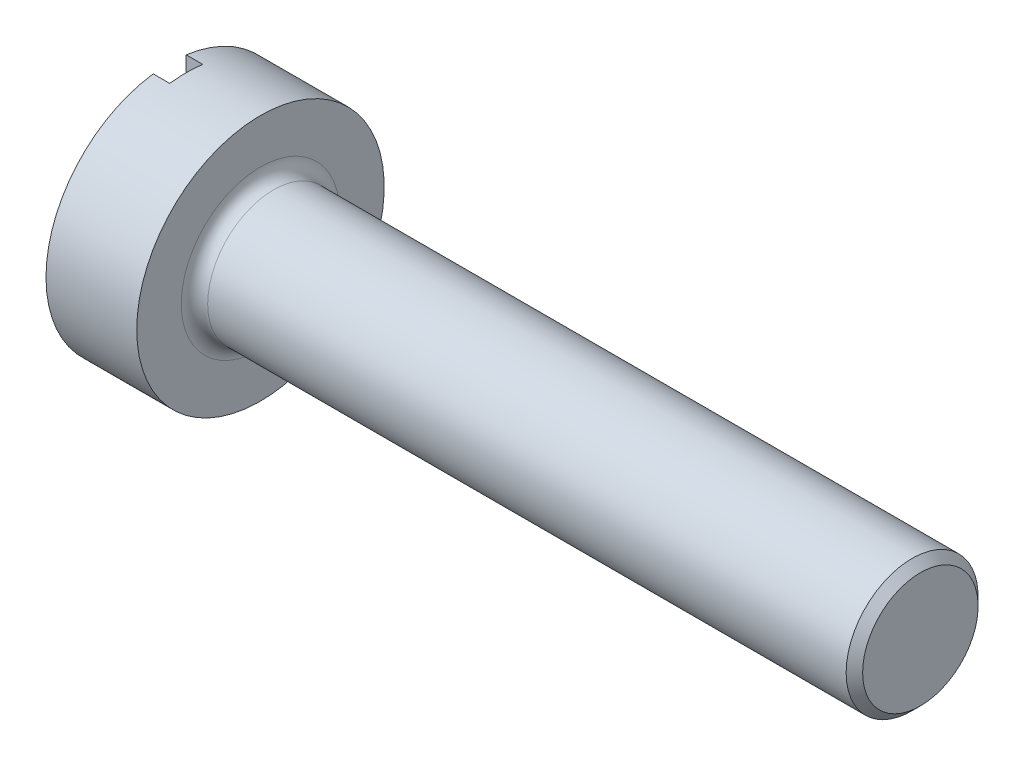
ISO-10303-21;
HEADER;
FILE_DESCRIPTION(('STEP AP214'),'2;1');
FILE_NAME('part.step','',(''),(''),'','','');
FILE_SCHEMA(('AUTOMOTIVE_DESIGN { 1 0 10303 214 1 1 1 1 }'));
ENDSEC;
DATA;
#1=APPLICATION_CONTEXT('core data for automotive mechanical design processes');
#2=APPLICATION_PROTOCOL_DEFINITION('international standard','automotive_design',2000,#1);
#3=PRODUCT_CONTEXT('',#1,'mechanical');
#4=PRODUCT('Part','Part','',(#3));
#5=PRODUCT_RELATED_PRODUCT_CATEGORY('part','',(#4));
#6=PRODUCT_DEFINITION_FORMATION('','',#4);
#7=PRODUCT_DEFINITION_CONTEXT('part definition',#1,'design');
#8=PRODUCT_DEFINITION('design','',#6,#7);
#9=PRODUCT_DEFINITION_SHAPE('','',#8);
#10=(LENGTH_UNIT() NAMED_UNIT(*) SI_UNIT(.MILLI.,.METRE.));
#11=(NAMED_UNIT(*) PLANE_ANGLE_UNIT() SI_UNIT($,.RADIAN.));
#12=(NAMED_UNIT(*) SI_UNIT($,.STERADIAN.) SOLID_ANGLE_UNIT());
#13=UNCERTAINTY_MEASURE_WITH_UNIT(LENGTH_MEASURE(1.E-05),#10,'distance_accuracy_value','');
#14=(GEOMETRIC_REPRESENTATION_CONTEXT(3) GLOBAL_UNCERTAINTY_ASSIGNED_CONTEXT((#13)) GLOBAL_UNIT_ASSIGNED_CONTEXT((#10,
#11,#12)) REPRESENTATION_CONTEXT('',''));
#15=CARTESIAN_POINT('',(0.,0.,0.));
#16=DIRECTION('',(0.,0.,1.));
#17=DIRECTION('',(1.,0.,0.));
#18=AXIS2_PLACEMENT_3D('',#15,#16,#17);
#19=CARTESIAN_POINT('',(0.,0.,0.));
#20=DIRECTION('',(-1.,0.,0.));
#21=DIRECTION('',(0.,0.,1.));
#22=AXIS2_PLACEMENT_3D('',#19,#20,#21);
#23=PLANE('',#22);
#24=CARTESIAN_POINT('',(0.,0.,0.));
#25=DIRECTION('',(-1.,0.,0.));
#26=DIRECTION('',(0.,0.,1.));
#27=AXIS2_PLACEMENT_3D('',#24,#25,#26);
#28=CIRCLE('',#27,1.5);
#29=CARTESIAN_POINT('',(0.,1.48660687473185,-0.2));
#30=VERTEX_POINT('',#29);
#31=CARTESIAN_POINT('',(0.,-1.48660687473185,-0.2));
#32=VERTEX_POINT('',#31);
#33=EDGE_CURVE('E86',#30,#32,#28,.T.);
#34=ORIENTED_EDGE('',*,*,#33,.T.);
#35=DIRECTION('',(0.,1.,0.));
#36=VECTOR('',#35,1.);
#37=CARTESIAN_POINT('',(0.,-1.5,-0.2));
#38=LINE('',#37,#36);
#39=EDGE_CURVE('E52',#32,#30,#38,.T.);
#40=ORIENTED_EDGE('',*,*,#39,.T.);
#41=EDGE_LOOP('',(#34,#40));
#42=FACE_BOUND('',#41,.T.);
#43=ADVANCED_FACE('F37',(#42),#23,.T.);
#44=CARTESIAN_POINT('',(0.,0.,0.));
#45=DIRECTION('',(-1.,0.,0.));
#46=DIRECTION('',(0.,0.,1.));
#47=AXIS2_PLACEMENT_3D('',#44,#45,#46);
#48=CYLINDRICAL_SURFACE('',#47,1.5);
#49=CARTESIAN_POINT('',(1.1,0.,0.));
#50=DIRECTION('',(-1.,0.,0.));
#51=DIRECTION('',(0.,0.,1.));
#52=AXIS2_PLACEMENT_3D('',#49,#50,#51);
#53=CIRCLE('',#52,1.5);
#54=CARTESIAN_POINT('',(1.1,0.,1.5));
#55=VERTEX_POINT('',#54);
#56=EDGE_CURVE('E92',#55,#55,#53,.T.);
#57=ORIENTED_EDGE('',*,*,#56,.T.);
#58=EDGE_LOOP('',(#57));
#59=FACE_BOUND('',#58,.T.);
#60=DIRECTION('',(-1.,0.,0.));
#61=VECTOR('',#60,1.);
#62=CARTESIAN_POINT('',(0.,-1.48660687473185,0.2));
#63=LINE('',#62,#61);
#64=CARTESIAN_POINT('',(0.2,-1.48660687473185,0.2));
#65=VERTEX_POINT('',#64);
#66=CARTESIAN_POINT('',(0.,-1.48660687473185,0.2));
#67=VERTEX_POINT('',#66);
#68=EDGE_CURVE('E11',#65,#67,#63,.T.);
#69=ORIENTED_EDGE('',*,*,#68,.F.);
#70=CARTESIAN_POINT('',(0.2,0.,0.));
#71=DIRECTION('',(-1.,0.,0.));
#72=DIRECTION('',(0.,0.,1.));
#73=AXIS2_PLACEMENT_3D('',#70,#71,#72);
#74=CIRCLE('',#73,1.5);
#75=CARTESIAN_POINT('',(0.2,-1.48660687473185,-0.2));
#76=VERTEX_POINT('',#75);
#77=EDGE_CURVE('E115',#65,#76,#74,.F.);
#78=ORIENTED_EDGE('',*,*,#77,.T.);
#79=DIRECTION('',(-1.,0.,0.));
#80=VECTOR('',#79,1.);
#81=CARTESIAN_POINT('',(0.,-1.48660687473185,-0.2));
#82=LINE('',#81,#80);
#83=EDGE_CURVE('E83',#76,#32,#82,.T.);
#84=ORIENTED_EDGE('',*,*,#83,.T.);
#85=ORIENTED_EDGE('',*,*,#33,.F.);
#86=DIRECTION('',(-1.,0.,0.));
#87=VECTOR('',#86,1.);
#88=CARTESIAN_POINT('',(0.,1.48660687473185,-0.2));
#89=LINE('',#88,#87);
#90=CARTESIAN_POINT('',(0.2,1.48660687473185,-0.2));
#91=VERTEX_POINT('',#90);
#92=EDGE_CURVE('E45',#30,#91,#89,.F.);
#93=ORIENTED_EDGE('',*,*,#92,.T.);
#94=CARTESIAN_POINT('',(0.2,1.48660687473185,0.2));
#95=VERTEX_POINT('',#94);
#96=EDGE_CURVE('E113',#91,#95,#74,.F.);
#97=ORIENTED_EDGE('',*,*,#96,.T.);
#98=DIRECTION('',(-1.,0.,0.));
#99=VECTOR('',#98,1.);
#100=CARTESIAN_POINT('',(0.,1.48660687473185,0.2));
#101=LINE('',#100,#99);
#102=CARTESIAN_POINT('',(0.,1.48660687473185,0.2));
#103=VERTEX_POINT('',#102);
#104=EDGE_CURVE('E60',#103,#95,#101,.F.);
#105=ORIENTED_EDGE('',*,*,#104,.F.);
#106=EDGE_CURVE('E93',#67,#103,#28,.T.);
#107=ORIENTED_EDGE('',*,*,#106,.F.);
#108=EDGE_LOOP('',(#69,#78,#84,#85,#93,#97,#105,#107));
#109=FACE_BOUND('',#108,.T.);
#110=ADVANCED_FACE('F90',(#59,#109),#48,.T.);
#111=DIRECTION('',(0.,1.,0.));
#112=VECTOR('',#111,1.);
#113=CARTESIAN_POINT('',(0.,-1.5,0.2));
#114=LINE('',#113,#112);
#115=EDGE_CURVE('E87',#67,#103,#114,.T.);
#116=ORIENTED_EDGE('',*,*,#115,.F.);
#117=ORIENTED_EDGE('',*,*,#106,.T.);
#118=EDGE_LOOP('',(#116,#117));
#119=FACE_BOUND('',#118,.T.);
#120=ADVANCED_FACE('F125',(#119),#23,.T.);
#121=CARTESIAN_POINT('',(9.1,0.,0.));
#122=DIRECTION('',(-1.,0.,0.));
#123=DIRECTION('',(0.,0.,1.));
#124=AXIS2_PLACEMENT_3D('',#121,#122,#123);
#125=PLANE('',#124);
#126=CARTESIAN_POINT('',(9.1,0.,0.));
#127=DIRECTION('',(-1.,0.,0.));
#128=DIRECTION('',(0.,0.,1.));
#129=AXIS2_PLACEMENT_3D('',#126,#127,#128);
#130=CIRCLE('',#129,0.699999999999998);
#131=CARTESIAN_POINT('',(9.1,0.,0.699999999999998));
#132=VERTEX_POINT('',#131);
#133=EDGE_CURVE('E104',#132,#132,#130,.F.);
#134=ORIENTED_EDGE('',*,*,#133,.T.);
#135=EDGE_LOOP('',(#134));
#136=FACE_BOUND('',#135,.T.);
#137=ADVANCED_FACE('F127',(#136),#125,.F.);
#138=CARTESIAN_POINT('',(0.,0.,0.));
#139=DIRECTION('',(-1.,0.,0.));
#140=DIRECTION('',(0.,0.,1.));
#141=AXIS2_PLACEMENT_3D('',#138,#139,#140);
#142=CYLINDRICAL_SURFACE('',#141,0.800000000000001);
#143=CARTESIAN_POINT('',(1.26,0.,0.));
#144=DIRECTION('',(1.,0.,0.));
#145=DIRECTION('',(0.,0.,-1.));
#146=AXIS2_PLACEMENT_3D('',#143,#144,#145);
#147=CIRCLE('',#146,0.800000000000001);
#148=CARTESIAN_POINT('',(1.26,0.,-0.800000000000001));
#149=VERTEX_POINT('',#148);
#150=EDGE_CURVE('E110',#149,#149,#147,.T.);
#151=ORIENTED_EDGE('',*,*,#150,.T.);
#152=EDGE_LOOP('',(#151));
#153=FACE_BOUND('',#152,.T.);
#154=CARTESIAN_POINT('',(9.,0.,0.));
#155=DIRECTION('',(-1.,0.,0.));
#156=DIRECTION('',(0.,0.,1.));
#157=AXIS2_PLACEMENT_3D('',#154,#155,#156);
#158=CIRCLE('',#157,0.800000000000001);
#159=CARTESIAN_POINT('',(9.,0.,0.800000000000001));
#160=VERTEX_POINT('',#159);
#161=EDGE_CURVE('E96',#160,#160,#158,.T.);
#162=ORIENTED_EDGE('',*,*,#161,.T.);
#163=EDGE_LOOP('',(#162));
#164=FACE_BOUND('',#163,.T.);
#165=ADVANCED_FACE('F133',(#153,#164),#142,.T.);
#166=CARTESIAN_POINT('',(1.1,0.,0.));
#167=DIRECTION('',(1.,0.,0.));
#168=DIRECTION('',(0.,0.,-1.));
#169=AXIS2_PLACEMENT_3D('',#166,#167,#168);
#170=PLANE('',#169);
#171=CARTESIAN_POINT('',(1.1,0.,0.));
#172=DIRECTION('',(1.,0.,0.));
#173=DIRECTION('',(0.,0.,-1.));
#174=AXIS2_PLACEMENT_3D('',#171,#172,#173);
#175=CIRCLE('',#174,0.960000000000001);
#176=CARTESIAN_POINT('',(1.1,0.,-0.960000000000001));
#177=VERTEX_POINT('',#176);
#178=EDGE_CURVE('E107',#177,#177,#175,.F.);
#179=ORIENTED_EDGE('',*,*,#178,.T.);
#180=EDGE_LOOP('',(#179));
#181=FACE_BOUND('',#180,.T.);
#182=ORIENTED_EDGE('',*,*,#56,.F.);
#183=EDGE_LOOP('',(#182));
#184=FACE_BOUND('',#183,.T.);
#185=ADVANCED_FACE('F183',(#181,#184),#170,.T.);
#186=CARTESIAN_POINT('',(9.,0.,0.));
#187=DIRECTION('',(-1.,0.,0.));
#188=DIRECTION('',(0.,0.,1.));
#189=AXIS2_PLACEMENT_3D('',#186,#187,#188);
#190=CONICAL_SURFACE('',#189,0.800000000000001,0.785398163397445);
#191=ORIENTED_EDGE('',*,*,#133,.F.);
#192=EDGE_LOOP('',(#191));
#193=FACE_BOUND('',#192,.T.);
#194=ORIENTED_EDGE('',*,*,#161,.F.);
#195=EDGE_LOOP('',(#194));
#196=FACE_BOUND('',#195,.T.);
#197=ADVANCED_FACE('F186',(#193,#196),#190,.T.);
#198=CARTESIAN_POINT('',(1.26,0.,0.));
#199=DIRECTION('',(1.,0.,0.));
#200=DIRECTION('',(0.,0.,-1.));
#201=AXIS2_PLACEMENT_3D('',#198,#199,#200);
#202=TOROIDAL_SURFACE('',#201,0.960000000000001,0.16);
#203=ORIENTED_EDGE('',*,*,#150,.F.);
#204=EDGE_LOOP('',(#203));
#205=FACE_BOUND('',#204,.T.);
#206=ORIENTED_EDGE('',*,*,#178,.F.);
#207=EDGE_LOOP('',(#206));
#208=FACE_BOUND('',#207,.T.);
#209=ADVANCED_FACE('F39',(#205,#208),#202,.F.);
#210=CARTESIAN_POINT('',(0.2,-1.5,0.));
#211=DIRECTION('',(-1.,0.,0.));
#212=DIRECTION('',(0.,0.,1.));
#213=AXIS2_PLACEMENT_3D('',#210,#211,#212);
#214=PLANE('',#213);
#215=DIRECTION('',(0.,1.,0.));
#216=VECTOR('',#215,1.);
#217=CARTESIAN_POINT('',(0.2,-1.5,0.2));
#218=LINE('',#217,#216);
#219=EDGE_CURVE('E99',#65,#95,#218,.T.);
#220=ORIENTED_EDGE('',*,*,#219,.T.);
#221=ORIENTED_EDGE('',*,*,#96,.F.);
#222=DIRECTION('',(0.,1.,0.));
#223=VECTOR('',#222,1.);
#224=CARTESIAN_POINT('',(0.2,-1.5,-0.2));
#225=LINE('',#224,#223);
#226=EDGE_CURVE('E79',#76,#91,#225,.T.);
#227=ORIENTED_EDGE('',*,*,#226,.F.);
#228=ORIENTED_EDGE('',*,*,#77,.F.);
#229=EDGE_LOOP('',(#220,#221,#227,#228));
#230=FACE_BOUND('',#229,.T.);
#231=ADVANCED_FACE('F119',(#230),#214,.T.);
#232=CARTESIAN_POINT('',(0.,-1.5,0.2));
#233=DIRECTION('',(0.,0.,1.));
#234=DIRECTION('',(1.,0.,0.));
#235=AXIS2_PLACEMENT_3D('',#232,#233,#234);
#236=PLANE('',#235);
#237=ORIENTED_EDGE('',*,*,#104,.T.);
#238=ORIENTED_EDGE('',*,*,#219,.F.);
#239=ORIENTED_EDGE('',*,*,#68,.T.);
#240=ORIENTED_EDGE('',*,*,#115,.T.);
#241=EDGE_LOOP('',(#237,#238,#239,#240));
#242=FACE_BOUND('',#241,.T.);
#243=ADVANCED_FACE('F120',(#242),#236,.F.);
#244=CARTESIAN_POINT('',(0.,-1.5,-0.2));
#245=DIRECTION('',(0.,0.,1.));
#246=DIRECTION('',(1.,0.,0.));
#247=AXIS2_PLACEMENT_3D('',#244,#245,#246);
#248=PLANE('',#247);
#249=ORIENTED_EDGE('',*,*,#39,.F.);
#250=ORIENTED_EDGE('',*,*,#83,.F.);
#251=ORIENTED_EDGE('',*,*,#226,.T.);
#252=ORIENTED_EDGE('',*,*,#92,.F.);
#253=EDGE_LOOP('',(#249,#250,#251,#252));
#254=FACE_BOUND('',#253,.T.);
#255=ADVANCED_FACE('F77',(#254),#248,.T.);
#256=CLOSED_SHELL('',(#43,#110,#120,#137,#165,#185,#197,#209,#231,#243,#255));
#257=MANIFOLD_SOLID_BREP('B2',#256);
#258=ADVANCED_BREP_SHAPE_REPRESENTATION('',(#18,#257),#14);
#259=SHAPE_DEFINITION_REPRESENTATION(#9,#258);
ENDSEC;
END-ISO-10303-21;
